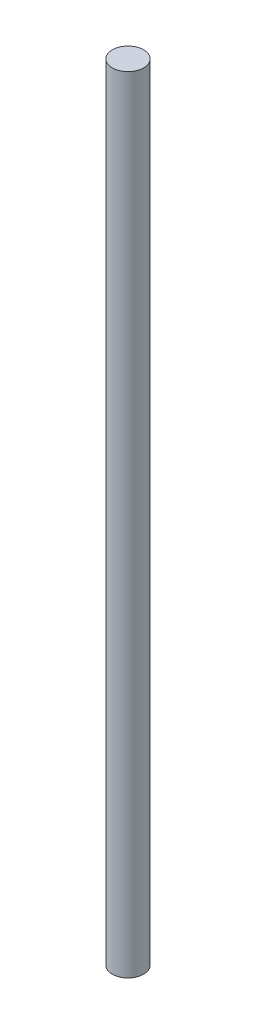
ISO-10303-21;
HEADER;
FILE_DESCRIPTION(('STEP AP214'),'2;1');
FILE_NAME('part.step','',(''),(''),'','','');
FILE_SCHEMA(('AUTOMOTIVE_DESIGN { 1 0 10303 214 1 1 1 1 }'));
ENDSEC;
DATA;
#1=APPLICATION_CONTEXT('core data for automotive mechanical design processes');
#2=APPLICATION_PROTOCOL_DEFINITION('international standard','automotive_design',2000,#1);
#3=PRODUCT_CONTEXT('',#1,'mechanical');
#4=PRODUCT('Part','Part','',(#3));
#5=PRODUCT_RELATED_PRODUCT_CATEGORY('part','',(#4));
#6=PRODUCT_DEFINITION_FORMATION('','',#4);
#7=PRODUCT_DEFINITION_CONTEXT('part definition',#1,'design');
#8=PRODUCT_DEFINITION('design','',#6,#7);
#9=PRODUCT_DEFINITION_SHAPE('','',#8);
#10=(LENGTH_UNIT() NAMED_UNIT(*) SI_UNIT(.MILLI.,.METRE.));
#11=(NAMED_UNIT(*) PLANE_ANGLE_UNIT() SI_UNIT($,.RADIAN.));
#12=(NAMED_UNIT(*) SI_UNIT($,.STERADIAN.) SOLID_ANGLE_UNIT());
#13=UNCERTAINTY_MEASURE_WITH_UNIT(LENGTH_MEASURE(1.E-05),#10,'distance_accuracy_value','');
#14=(GEOMETRIC_REPRESENTATION_CONTEXT(3) GLOBAL_UNCERTAINTY_ASSIGNED_CONTEXT((#13)) GLOBAL_UNIT_ASSIGNED_CONTEXT((#10,
#11,#12)) REPRESENTATION_CONTEXT('',''));
#15=CARTESIAN_POINT('',(0.,0.,0.));
#16=DIRECTION('',(0.,0.,1.));
#17=DIRECTION('',(1.,0.,0.));
#18=AXIS2_PLACEMENT_3D('',#15,#16,#17);
#19=CARTESIAN_POINT('',(0.,75.,0.));
#20=DIRECTION('',(0.,-1.,0.));
#21=DIRECTION('',(0.,0.,-1.));
#22=AXIS2_PLACEMENT_3D('',#19,#20,#21);
#23=CYLINDRICAL_SURFACE('',#22,3.);
#24=CARTESIAN_POINT('',(0.,75.,0.));
#25=DIRECTION('',(0.,1.,0.));
#26=DIRECTION('',(0.,0.,1.));
#27=AXIS2_PLACEMENT_3D('',#24,#25,#26);
#28=CIRCLE('',#27,3.);
#29=CARTESIAN_POINT('',(0.,75.,3.));
#30=VERTEX_POINT('',#29);
#31=EDGE_CURVE('E10',#30,#30,#28,.T.);
#32=ORIENTED_EDGE('',*,*,#31,.F.);
#33=EDGE_LOOP('',(#32));
#34=FACE_BOUND('',#33,.T.);
#35=CARTESIAN_POINT('',(0.,-75.,0.));
#36=DIRECTION('',(0.,1.,0.));
#37=DIRECTION('',(0.,0.,1.));
#38=AXIS2_PLACEMENT_3D('',#35,#36,#37);
#39=CIRCLE('',#38,3.);
#40=CARTESIAN_POINT('',(0.,-75.,3.));
#41=VERTEX_POINT('',#40);
#42=EDGE_CURVE('E36',#41,#41,#39,.T.);
#43=ORIENTED_EDGE('',*,*,#42,.T.);
#44=EDGE_LOOP('',(#43));
#45=FACE_BOUND('',#44,.T.);
#46=ADVANCED_FACE('F33',(#34,#45),#23,.T.);
#47=CARTESIAN_POINT('',(0.,75.,0.));
#48=DIRECTION('',(0.,1.,0.));
#49=DIRECTION('',(0.,0.,1.));
#50=AXIS2_PLACEMENT_3D('',#47,#48,#49);
#51=PLANE('',#50);
#52=ORIENTED_EDGE('',*,*,#31,.T.);
#53=EDGE_LOOP('',(#52));
#54=FACE_BOUND('',#53,.T.);
#55=ADVANCED_FACE('F48',(#54),#51,.T.);
#56=CARTESIAN_POINT('',(0.,-75.,0.));
#57=DIRECTION('',(0.,1.,0.));
#58=DIRECTION('',(0.,0.,1.));
#59=AXIS2_PLACEMENT_3D('',#56,#57,#58);
#60=PLANE('',#59);
#61=ORIENTED_EDGE('',*,*,#42,.F.);
#62=EDGE_LOOP('',(#61));
#63=FACE_BOUND('',#62,.T.);
#64=ADVANCED_FACE('F46',(#63),#60,.F.);
#65=CLOSED_SHELL('',(#46,#55,#64));
#66=MANIFOLD_SOLID_BREP('B2',#65);
#67=ADVANCED_BREP_SHAPE_REPRESENTATION('',(#18,#66),#14);
#68=SHAPE_DEFINITION_REPRESENTATION(#9,#67);
ENDSEC;
END-ISO-10303-21;
